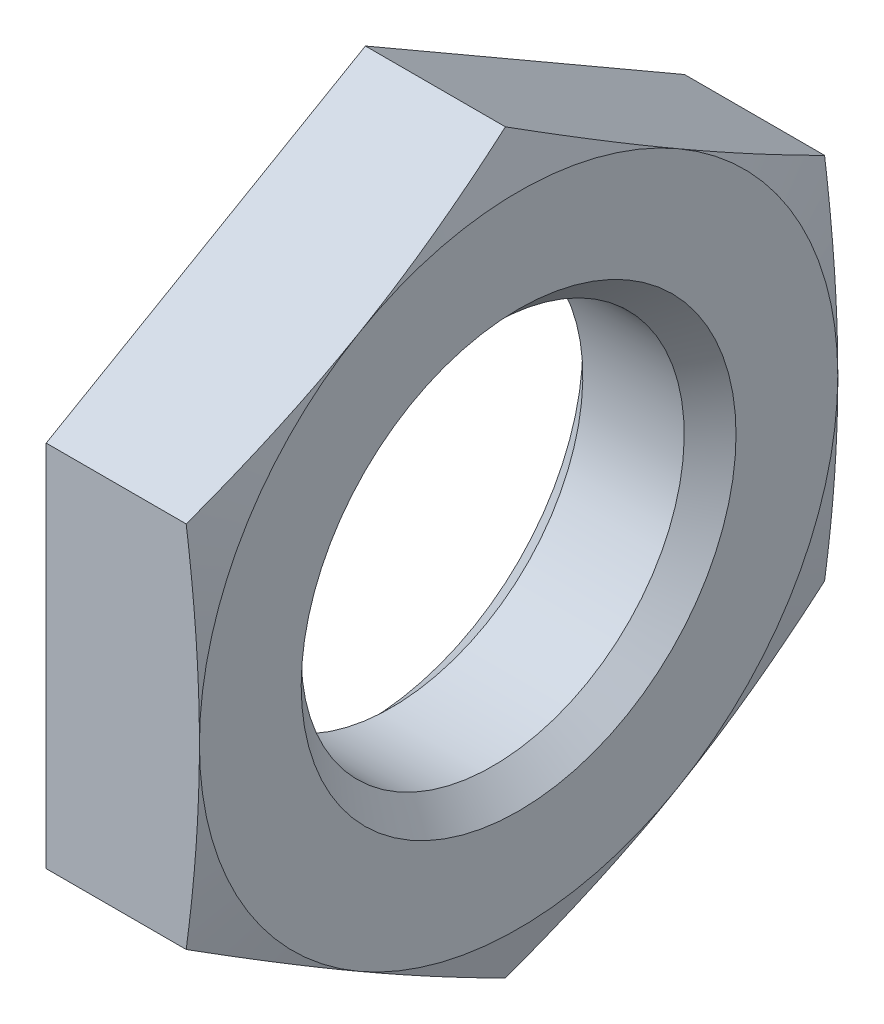
ISO-10303-21;
HEADER;
FILE_DESCRIPTION(('STEP AP214'),'2;1');
FILE_NAME('part.step','',(''),(''),'','','');
FILE_SCHEMA(('AUTOMOTIVE_DESIGN { 1 0 10303 214 1 1 1 1 }'));
ENDSEC;
DATA;
#1=APPLICATION_CONTEXT('core data for automotive mechanical design processes');
#2=APPLICATION_PROTOCOL_DEFINITION('international standard','automotive_design',2000,#1);
#3=PRODUCT_CONTEXT('',#1,'mechanical');
#4=PRODUCT('Part','Part','',(#3));
#5=PRODUCT_RELATED_PRODUCT_CATEGORY('part','',(#4));
#6=PRODUCT_DEFINITION_FORMATION('','',#4);
#7=PRODUCT_DEFINITION_CONTEXT('part definition',#1,'design');
#8=PRODUCT_DEFINITION('design','',#6,#7);
#9=PRODUCT_DEFINITION_SHAPE('','',#8);
#10=(LENGTH_UNIT() NAMED_UNIT(*) SI_UNIT(.MILLI.,.METRE.));
#11=(NAMED_UNIT(*) PLANE_ANGLE_UNIT() SI_UNIT($,.RADIAN.));
#12=(NAMED_UNIT(*) SI_UNIT($,.STERADIAN.) SOLID_ANGLE_UNIT());
#13=UNCERTAINTY_MEASURE_WITH_UNIT(LENGTH_MEASURE(1.E-05),#10,'distance_accuracy_value','');
#14=(GEOMETRIC_REPRESENTATION_CONTEXT(3) GLOBAL_UNCERTAINTY_ASSIGNED_CONTEXT((#13)) GLOBAL_UNIT_ASSIGNED_CONTEXT((#10,
#11,#12)) REPRESENTATION_CONTEXT('',''));
#15=CARTESIAN_POINT('',(0.,0.,0.));
#16=DIRECTION('',(0.,0.,1.));
#17=DIRECTION('',(1.,0.,0.));
#18=AXIS2_PLACEMENT_3D('',#15,#16,#17);
#19=CARTESIAN_POINT('',(-0.24,-4.3301270189222,-2.5));
#20=DIRECTION('',(0.,-0.866025403784439,-0.5));
#21=DIRECTION('',(0.,0.5,-0.866025403784439));
#22=AXIS2_PLACEMENT_3D('',#19,#20,#21);
#23=PLANE('',#22);
#24=DIRECTION('',(0.,-0.5,0.866025403784439));
#25=VECTOR('',#24,1.);
#26=CARTESIAN_POINT('',(0.,-3.95423059027645,-3.1510717127981));
#27=LINE('',#26,#25);
#28=CARTESIAN_POINT('',(0.,-2.88675134594813,-5.));
#29=VERTEX_POINT('',#28);
#30=CARTESIAN_POINT('',(0.,-5.77350269189626,0.));
#31=VERTEX_POINT('',#30);
#32=EDGE_CURVE('E122',#29,#31,#27,.T.);
#33=ORIENTED_EDGE('',*,*,#32,.F.);
#34=DIRECTION('',(1.,0.,0.));
#35=VECTOR('',#34,1.);
#36=CARTESIAN_POINT('',(-0.24,-2.88675134594813,-5.));
#37=LINE('',#36,#35);
#38=CARTESIAN_POINT('',(2.1927405783631,-2.88675134594813,-5.));
#39=VERTEX_POINT('',#38);
#40=EDGE_CURVE('E10',#29,#39,#37,.T.);
#41=ORIENTED_EDGE('',*,*,#40,.T.);
#42=CARTESIAN_POINT('',(2.12820765026172,-6.00137804865762,0.394691695703557));
#43=CARTESIAN_POINT('',(2.4,-5.08879735052134,-1.18594443947517));
#44=CARTESIAN_POINT('',(2.4,-4.3301270189222,-2.5));
#45=CARTESIAN_POINT('',(2.4,-3.57145668732306,-3.81405556052483));
#46=CARTESIAN_POINT('',(2.12820765026172,-2.65887598918677,-5.39469169570356));
#47=(BOUNDED_CURVE() B_SPLINE_CURVE(2,(#42,#43,#44,#45,#46),.UNSPECIFIED.,.F.,
.F.) B_SPLINE_CURVE_WITH_KNOTS((3,2,3),(0.,3.35590423776051,6.71180847552102),
.UNSPECIFIED.) CURVE() GEOMETRIC_REPRESENTATION_ITEM() RATIONAL_B_SPLINE_CURVE((1.,
1.04949239436652,1.,1.04949239436651,1.)) REPRESENTATION_ITEM(''));
#48=CARTESIAN_POINT('',(2.4,-4.3301270189222,-2.5));
#49=VERTEX_POINT('',#48);
#50=EDGE_CURVE('E149',#49,#39,#47,.T.);
#51=ORIENTED_EDGE('',*,*,#50,.F.);
#52=CARTESIAN_POINT('',(2.12820765026172,-6.00137804865762,0.394691695703557));
#53=CARTESIAN_POINT('',(2.4,-5.08879735052134,-1.18594443947517));
#54=CARTESIAN_POINT('',(2.4,-4.3301270189222,-2.5));
#55=CARTESIAN_POINT('',(2.4,-3.57145668732306,-3.81405556052483));
#56=CARTESIAN_POINT('',(2.12820765026172,-2.65887598918677,-5.39469169570356));
#57=(BOUNDED_CURVE() B_SPLINE_CURVE(2,(#52,#53,#54,#55,#56),.UNSPECIFIED.,.F.,
.F.) B_SPLINE_CURVE_WITH_KNOTS((3,2,3),(0.,3.35590423776051,6.71180847552102),
.UNSPECIFIED.) CURVE() GEOMETRIC_REPRESENTATION_ITEM() RATIONAL_B_SPLINE_CURVE((1.,
1.04949239436652,1.,1.04949239436651,1.)) REPRESENTATION_ITEM(''));
#58=CARTESIAN_POINT('',(2.1927405783631,-5.77350269189626,0.));
#59=VERTEX_POINT('',#58);
#60=EDGE_CURVE('E150',#59,#49,#57,.T.);
#61=ORIENTED_EDGE('',*,*,#60,.F.);
#62=DIRECTION('',(1.,0.,0.));
#63=VECTOR('',#62,1.);
#64=CARTESIAN_POINT('',(-0.24,-5.77350269189626,0.));
#65=LINE('',#64,#63);
#66=EDGE_CURVE('E133',#31,#59,#65,.T.);
#67=ORIENTED_EDGE('',*,*,#66,.F.);
#68=EDGE_LOOP('',(#33,#41,#51,#61,#67));
#69=FACE_BOUND('',#68,.T.);
#70=ADVANCED_FACE('F15',(#69),#23,.T.);
#71=CARTESIAN_POINT('',(-0.24,0.,-5.));
#72=DIRECTION('',(0.,0.,-1.));
#73=DIRECTION('',(0.,1.,0.));
#74=AXIS2_PLACEMENT_3D('',#71,#72,#73);
#75=PLANE('',#74);
#76=DIRECTION('',(0.,-1.,0.));
#77=VECTOR('',#76,1.);
#78=CARTESIAN_POINT('',(0.,1.50358571458295,-5.));
#79=LINE('',#78,#77);
#80=CARTESIAN_POINT('',(0.,2.88675134594812,-5.));
#81=VERTEX_POINT('',#80);
#82=EDGE_CURVE('E19',#81,#29,#79,.T.);
#83=ORIENTED_EDGE('',*,*,#82,.F.);
#84=DIRECTION('',(1.,0.,0.));
#85=VECTOR('',#84,1.);
#86=CARTESIAN_POINT('',(-0.24,2.88675134594812,-5.));
#87=LINE('',#86,#85);
#88=CARTESIAN_POINT('',(2.1927405783631,2.88675134594812,-5.));
#89=VERTEX_POINT('',#88);
#90=EDGE_CURVE('E24',#81,#89,#87,.T.);
#91=ORIENTED_EDGE('',*,*,#90,.T.);
#92=CARTESIAN_POINT('',(2.12820765026172,-3.34250205947085,-5.));
#93=CARTESIAN_POINT('',(2.4,-1.51734066319828,-5.));
#94=CARTESIAN_POINT('',(2.4,0.,-5.));
#95=CARTESIAN_POINT('',(2.4,1.51734066319828,-5.));
#96=CARTESIAN_POINT('',(2.12820765026172,3.34250205947085,-5.));
#97=(BOUNDED_CURVE() B_SPLINE_CURVE(2,(#92,#93,#94,#95,#96),.UNSPECIFIED.,.F.,
.F.) B_SPLINE_CURVE_WITH_KNOTS((3,2,3),(0.,3.35590423776051,6.71180847552102),
.UNSPECIFIED.) CURVE() GEOMETRIC_REPRESENTATION_ITEM() RATIONAL_B_SPLINE_CURVE((1.,
1.04949239436653,1.,1.04949239436653,1.)) REPRESENTATION_ITEM(''));
#98=CARTESIAN_POINT('',(2.4,0.,-5.));
#99=VERTEX_POINT('',#98);
#100=EDGE_CURVE('E175',#99,#89,#97,.T.);
#101=ORIENTED_EDGE('',*,*,#100,.F.);
#102=CARTESIAN_POINT('',(2.12820765026172,-3.34250205947085,-5.));
#103=CARTESIAN_POINT('',(2.4,-1.51734066319828,-5.));
#104=CARTESIAN_POINT('',(2.4,0.,-5.));
#105=CARTESIAN_POINT('',(2.4,1.51734066319828,-5.));
#106=CARTESIAN_POINT('',(2.12820765026172,3.34250205947085,-5.));
#107=(BOUNDED_CURVE() B_SPLINE_CURVE(2,(#102,#103,#104,#105,#106),.UNSPECIFIED.,.F.,
.F.) B_SPLINE_CURVE_WITH_KNOTS((3,2,3),(0.,3.35590423776051,6.71180847552102),
.UNSPECIFIED.) CURVE() GEOMETRIC_REPRESENTATION_ITEM() RATIONAL_B_SPLINE_CURVE((1.,
1.04949239436653,1.,1.04949239436653,1.)) REPRESENTATION_ITEM(''));
#108=EDGE_CURVE('E116',#39,#99,#107,.T.);
#109=ORIENTED_EDGE('',*,*,#108,.F.);
#110=ORIENTED_EDGE('',*,*,#40,.F.);
#111=EDGE_LOOP('',(#83,#91,#101,#109,#110));
#112=FACE_BOUND('',#111,.T.);
#113=ADVANCED_FACE('F278',(#112),#75,.T.);
#114=CARTESIAN_POINT('',(-0.24,4.3301270189222,-2.5));
#115=DIRECTION('',(0.,0.866025403784439,-0.5));
#116=DIRECTION('',(0.,0.5,0.866025403784439));
#117=AXIS2_PLACEMENT_3D('',#114,#115,#116);
#118=PLANE('',#117);
#119=DIRECTION('',(0.,-0.5,-0.866025403784439));
#120=VECTOR('',#119,1.);
#121=CARTESIAN_POINT('',(0.,4.70602344756793,-1.8489282872019));
#122=LINE('',#121,#120);
#123=CARTESIAN_POINT('',(0.,5.77350269189626,0.));
#124=VERTEX_POINT('',#123);
#125=EDGE_CURVE('E173',#124,#81,#122,.T.);
#126=ORIENTED_EDGE('',*,*,#125,.F.);
#127=DIRECTION('',(1.,0.,0.));
#128=VECTOR('',#127,1.);
#129=CARTESIAN_POINT('',(-0.24,5.77350269189626,0.));
#130=LINE('',#129,#128);
#131=CARTESIAN_POINT('',(2.1927405783631,5.77350269189626,0.));
#132=VERTEX_POINT('',#131);
#133=EDGE_CURVE('E117',#124,#132,#130,.T.);
#134=ORIENTED_EDGE('',*,*,#133,.T.);
#135=CARTESIAN_POINT('',(2.12820765026172,2.65887598918677,-5.39469169570356));
#136=CARTESIAN_POINT('',(2.4,3.57145668732307,-3.81405556052483));
#137=CARTESIAN_POINT('',(2.4,4.33012701892219,-2.5));
#138=CARTESIAN_POINT('',(2.4,5.08879735052132,-1.18594443947518));
#139=CARTESIAN_POINT('',(2.12820765026172,6.00137804865762,0.394691695703558));
#140=(BOUNDED_CURVE() B_SPLINE_CURVE(2,(#135,#136,#137,#138,#139),.UNSPECIFIED.,.F.,
.F.) B_SPLINE_CURVE_WITH_KNOTS((3,2,3),(0.,3.35590423776051,6.71180847552102),
.UNSPECIFIED.) CURVE() GEOMETRIC_REPRESENTATION_ITEM() RATIONAL_B_SPLINE_CURVE((1.,
1.04949239436653,1.,1.04949239436651,1.)) REPRESENTATION_ITEM(''));
#141=CARTESIAN_POINT('',(2.4,4.33012701892219,-2.5));
#142=VERTEX_POINT('',#141);
#143=EDGE_CURVE('E98',#142,#132,#140,.T.);
#144=ORIENTED_EDGE('',*,*,#143,.F.);
#145=CARTESIAN_POINT('',(2.12820765026172,2.65887598918677,-5.39469169570356));
#146=CARTESIAN_POINT('',(2.4,3.57145668732307,-3.81405556052483));
#147=CARTESIAN_POINT('',(2.4,4.33012701892219,-2.5));
#148=CARTESIAN_POINT('',(2.4,5.08879735052132,-1.18594443947518));
#149=CARTESIAN_POINT('',(2.12820765026172,6.00137804865762,0.394691695703558));
#150=(BOUNDED_CURVE() B_SPLINE_CURVE(2,(#145,#146,#147,#148,#149),.UNSPECIFIED.,.F.,
.F.) B_SPLINE_CURVE_WITH_KNOTS((3,2,3),(0.,3.35590423776051,6.71180847552102),
.UNSPECIFIED.) CURVE() GEOMETRIC_REPRESENTATION_ITEM() RATIONAL_B_SPLINE_CURVE((1.,
1.04949239436653,1.,1.04949239436651,1.)) REPRESENTATION_ITEM(''));
#151=EDGE_CURVE('E86',#89,#142,#150,.T.);
#152=ORIENTED_EDGE('',*,*,#151,.F.);
#153=ORIENTED_EDGE('',*,*,#90,.F.);
#154=EDGE_LOOP('',(#126,#134,#144,#152,#153));
#155=FACE_BOUND('',#154,.T.);
#156=ADVANCED_FACE('F243',(#155),#118,.T.);
#157=CARTESIAN_POINT('',(-0.24,-4.3301270189222,2.5));
#158=DIRECTION('',(0.,-0.866025403784439,0.5));
#159=DIRECTION('',(0.,-0.5,-0.866025403784439));
#160=AXIS2_PLACEMENT_3D('',#157,#158,#159);
#161=PLANE('',#160);
#162=DIRECTION('',(0.,0.5,0.866025403784439));
#163=VECTOR('',#162,1.);
#164=CARTESIAN_POINT('',(0.,-3.95423059027645,3.15107171279811));
#165=LINE('',#164,#163);
#166=CARTESIAN_POINT('',(0.,-2.88675134594813,5.));
#167=VERTEX_POINT('',#166);
#168=EDGE_CURVE('E115',#31,#167,#165,.T.);
#169=ORIENTED_EDGE('',*,*,#168,.F.);
#170=ORIENTED_EDGE('',*,*,#66,.T.);
#171=CARTESIAN_POINT('',(2.12820765026172,-2.65887598918677,5.39469169570356));
#172=CARTESIAN_POINT('',(2.4,-3.57145668732306,3.81405556052482));
#173=CARTESIAN_POINT('',(2.4,-4.3301270189222,2.5));
#174=CARTESIAN_POINT('',(2.4,-5.08879735052134,1.18594443947517));
#175=CARTESIAN_POINT('',(2.12820765026172,-6.00137804865762,-0.394691695703558));
#176=(BOUNDED_CURVE() B_SPLINE_CURVE(2,(#171,#172,#173,#174,#175),.UNSPECIFIED.,.F.,
.F.) B_SPLINE_CURVE_WITH_KNOTS((3,2,3),(0.,3.35590423776052,6.71180847552102),
.UNSPECIFIED.) CURVE() GEOMETRIC_REPRESENTATION_ITEM() RATIONAL_B_SPLINE_CURVE((1.,
1.04949239436654,1.,1.0494923943665,1.)) REPRESENTATION_ITEM(''));
#177=CARTESIAN_POINT('',(2.4,-4.3301270189222,2.5));
#178=VERTEX_POINT('',#177);
#179=EDGE_CURVE('E111',#178,#59,#176,.T.);
#180=ORIENTED_EDGE('',*,*,#179,.F.);
#181=CARTESIAN_POINT('',(2.12820765026172,-2.65887598918677,5.39469169570356));
#182=CARTESIAN_POINT('',(2.4,-3.57145668732306,3.81405556052482));
#183=CARTESIAN_POINT('',(2.4,-4.3301270189222,2.5));
#184=CARTESIAN_POINT('',(2.4,-5.08879735052134,1.18594443947517));
#185=CARTESIAN_POINT('',(2.12820765026172,-6.00137804865762,-0.394691695703558));
#186=(BOUNDED_CURVE() B_SPLINE_CURVE(2,(#181,#182,#183,#184,#185),.UNSPECIFIED.,.F.,
.F.) B_SPLINE_CURVE_WITH_KNOTS((3,2,3),(0.,3.35590423776052,6.71180847552102),
.UNSPECIFIED.) CURVE() GEOMETRIC_REPRESENTATION_ITEM() RATIONAL_B_SPLINE_CURVE((1.,
1.04949239436654,1.,1.0494923943665,1.)) REPRESENTATION_ITEM(''));
#187=CARTESIAN_POINT('',(2.1927405783631,-2.88675134594813,5.));
#188=VERTEX_POINT('',#187);
#189=EDGE_CURVE('E112',#188,#178,#186,.T.);
#190=ORIENTED_EDGE('',*,*,#189,.F.);
#191=DIRECTION('',(1.,0.,0.));
#192=VECTOR('',#191,1.);
#193=CARTESIAN_POINT('',(-0.24,-2.88675134594813,5.));
#194=LINE('',#193,#192);
#195=EDGE_CURVE('E120',#167,#188,#194,.T.);
#196=ORIENTED_EDGE('',*,*,#195,.F.);
#197=EDGE_LOOP('',(#169,#170,#180,#190,#196));
#198=FACE_BOUND('',#197,.T.);
#199=ADVANCED_FACE('F270',(#198),#161,.T.);
#200=CARTESIAN_POINT('',(-0.24,0.,5.));
#201=DIRECTION('',(0.,0.,1.));
#202=DIRECTION('',(0.,-1.,0.));
#203=AXIS2_PLACEMENT_3D('',#200,#201,#202);
#204=PLANE('',#203);
#205=DIRECTION('',(0.,1.,0.));
#206=VECTOR('',#205,1.);
#207=CARTESIAN_POINT('',(0.,1.50358571458295,5.));
#208=LINE('',#207,#206);
#209=CARTESIAN_POINT('',(0.,2.88675134594813,5.));
#210=VERTEX_POINT('',#209);
#211=EDGE_CURVE('E174',#167,#210,#208,.T.);
#212=ORIENTED_EDGE('',*,*,#211,.F.);
#213=ORIENTED_EDGE('',*,*,#195,.T.);
#214=CARTESIAN_POINT('',(2.12820765026172,3.34250205947085,5.));
#215=CARTESIAN_POINT('',(2.4,1.51734066319828,4.99999999999999));
#216=CARTESIAN_POINT('',(2.4,0.,5.));
#217=CARTESIAN_POINT('',(2.4,-1.51734066319828,5.));
#218=CARTESIAN_POINT('',(2.12820765026172,-3.34250205947085,5.));
#219=(BOUNDED_CURVE() B_SPLINE_CURVE(2,(#214,#215,#216,#217,#218),.UNSPECIFIED.,.F.,
.F.) B_SPLINE_CURVE_WITH_KNOTS((3,2,3),(0.,3.35590423776052,6.71180847552103),
.UNSPECIFIED.) CURVE() GEOMETRIC_REPRESENTATION_ITEM() RATIONAL_B_SPLINE_CURVE((1.,
1.04949239436656,1.,1.04949239436653,1.)) REPRESENTATION_ITEM(''));
#220=CARTESIAN_POINT('',(2.4,0.,5.));
#221=VERTEX_POINT('',#220);
#222=EDGE_CURVE('E140',#221,#188,#219,.T.);
#223=ORIENTED_EDGE('',*,*,#222,.F.);
#224=CARTESIAN_POINT('',(2.12820765026172,3.34250205947085,5.));
#225=CARTESIAN_POINT('',(2.4,1.51734066319828,4.99999999999999));
#226=CARTESIAN_POINT('',(2.4,0.,5.));
#227=CARTESIAN_POINT('',(2.4,-1.51734066319828,5.));
#228=CARTESIAN_POINT('',(2.12820765026172,-3.34250205947085,5.));
#229=(BOUNDED_CURVE() B_SPLINE_CURVE(2,(#224,#225,#226,#227,#228),.UNSPECIFIED.,.F.,
.F.) B_SPLINE_CURVE_WITH_KNOTS((3,2,3),(0.,3.35590423776052,6.71180847552103),
.UNSPECIFIED.) CURVE() GEOMETRIC_REPRESENTATION_ITEM() RATIONAL_B_SPLINE_CURVE((1.,
1.04949239436656,1.,1.04949239436653,1.)) REPRESENTATION_ITEM(''));
#230=CARTESIAN_POINT('',(2.1927405783631,2.88675134594813,5.));
#231=VERTEX_POINT('',#230);
#232=EDGE_CURVE('E103',#231,#221,#229,.T.);
#233=ORIENTED_EDGE('',*,*,#232,.F.);
#234=DIRECTION('',(1.,0.,0.));
#235=VECTOR('',#234,1.);
#236=CARTESIAN_POINT('',(-0.24,2.88675134594813,5.));
#237=LINE('',#236,#235);
#238=EDGE_CURVE('E121',#210,#231,#237,.T.);
#239=ORIENTED_EDGE('',*,*,#238,.F.);
#240=EDGE_LOOP('',(#212,#213,#223,#233,#239));
#241=FACE_BOUND('',#240,.T.);
#242=ADVANCED_FACE('F264',(#241),#204,.T.);
#243=CARTESIAN_POINT('',(-0.24,4.3301270189222,2.5));
#244=DIRECTION('',(0.,0.866025403784439,0.5));
#245=DIRECTION('',(0.,-0.5,0.866025403784439));
#246=AXIS2_PLACEMENT_3D('',#243,#244,#245);
#247=PLANE('',#246);
#248=DIRECTION('',(0.,0.5,-0.866025403784439));
#249=VECTOR('',#248,1.);
#250=CARTESIAN_POINT('',(0.,4.70602344756793,1.84892828720189));
#251=LINE('',#250,#249);
#252=EDGE_CURVE('E167',#210,#124,#251,.T.);
#253=ORIENTED_EDGE('',*,*,#252,.F.);
#254=ORIENTED_EDGE('',*,*,#238,.T.);
#255=CARTESIAN_POINT('',(2.12820765026172,6.00137804865762,-0.39469169570356));
#256=CARTESIAN_POINT('',(2.4,5.08879735052134,1.18594443947518));
#257=CARTESIAN_POINT('',(2.4,4.3301270189222,2.5));
#258=CARTESIAN_POINT('',(2.4,3.57145668732306,3.81405556052482));
#259=CARTESIAN_POINT('',(2.12820765026172,2.65887598918678,5.39469169570356));
#260=(BOUNDED_CURVE() B_SPLINE_CURVE(2,(#255,#256,#257,#258,#259),.UNSPECIFIED.,.F.,
.F.) B_SPLINE_CURVE_WITH_KNOTS((3,2,3),(0.,3.35590423776051,6.71180847552102),
.UNSPECIFIED.) CURVE() GEOMETRIC_REPRESENTATION_ITEM() RATIONAL_B_SPLINE_CURVE((1.,
1.04949239436652,1.,1.04949239436654,1.)) REPRESENTATION_ITEM(''));
#261=CARTESIAN_POINT('',(2.4,4.3301270189222,2.5));
#262=VERTEX_POINT('',#261);
#263=EDGE_CURVE('E162',#262,#231,#260,.T.);
#264=ORIENTED_EDGE('',*,*,#263,.F.);
#265=CARTESIAN_POINT('',(2.12820765026172,6.00137804865762,-0.39469169570356));
#266=CARTESIAN_POINT('',(2.4,5.08879735052134,1.18594443947518));
#267=CARTESIAN_POINT('',(2.4,4.3301270189222,2.5));
#268=CARTESIAN_POINT('',(2.4,3.57145668732306,3.81405556052482));
#269=CARTESIAN_POINT('',(2.12820765026172,2.65887598918678,5.39469169570356));
#270=(BOUNDED_CURVE() B_SPLINE_CURVE(2,(#265,#266,#267,#268,#269),.UNSPECIFIED.,.F.,
.F.) B_SPLINE_CURVE_WITH_KNOTS((3,2,3),(0.,3.35590423776051,6.71180847552102),
.UNSPECIFIED.) CURVE() GEOMETRIC_REPRESENTATION_ITEM() RATIONAL_B_SPLINE_CURVE((1.,
1.04949239436652,1.,1.04949239436654,1.)) REPRESENTATION_ITEM(''));
#271=EDGE_CURVE('E180',#132,#262,#270,.T.);
#272=ORIENTED_EDGE('',*,*,#271,.F.);
#273=ORIENTED_EDGE('',*,*,#133,.F.);
#274=EDGE_LOOP('',(#253,#254,#264,#272,#273));
#275=FACE_BOUND('',#274,.T.);
#276=ADVANCED_FACE('F252',(#275),#247,.T.);
#277=CARTESIAN_POINT('',(2.4,2.5,0.));
#278=DIRECTION('',(1.,0.,0.));
#279=DIRECTION('',(0.,1.,0.));
#280=AXIS2_PLACEMENT_3D('',#277,#278,#279);
#281=PLANE('',#280);
#282=CARTESIAN_POINT('',(2.4,0.,0.));
#283=DIRECTION('',(1.,0.,0.));
#284=DIRECTION('',(0.,1.,0.));
#285=AXIS2_PLACEMENT_3D('',#282,#283,#284);
#286=CIRCLE('',#285,5.);
#287=EDGE_CURVE('E104',#142,#262,#286,.T.);
#288=ORIENTED_EDGE('',*,*,#287,.T.);
#289=CARTESIAN_POINT('',(2.4,0.,0.));
#290=DIRECTION('',(1.,0.,0.));
#291=DIRECTION('',(0.,1.,0.));
#292=AXIS2_PLACEMENT_3D('',#289,#290,#291);
#293=CIRCLE('',#292,5.);
#294=EDGE_CURVE('E96',#262,#221,#293,.T.);
#295=ORIENTED_EDGE('',*,*,#294,.T.);
#296=CARTESIAN_POINT('',(2.4,0.,0.));
#297=DIRECTION('',(1.,0.,0.));
#298=DIRECTION('',(0.,1.,0.));
#299=AXIS2_PLACEMENT_3D('',#296,#297,#298);
#300=CIRCLE('',#299,5.);
#301=EDGE_CURVE('E105',#221,#178,#300,.T.);
#302=ORIENTED_EDGE('',*,*,#301,.T.);
#303=CARTESIAN_POINT('',(2.4,0.,0.));
#304=DIRECTION('',(1.,0.,0.));
#305=DIRECTION('',(0.,1.,0.));
#306=AXIS2_PLACEMENT_3D('',#303,#304,#305);
#307=CIRCLE('',#306,5.);
#308=EDGE_CURVE('E146',#178,#49,#307,.T.);
#309=ORIENTED_EDGE('',*,*,#308,.T.);
#310=CARTESIAN_POINT('',(2.4,0.,0.));
#311=DIRECTION('',(1.,0.,0.));
#312=DIRECTION('',(0.,1.,0.));
#313=AXIS2_PLACEMENT_3D('',#310,#311,#312);
#314=CIRCLE('',#313,5.);
#315=EDGE_CURVE('E113',#49,#99,#314,.T.);
#316=ORIENTED_EDGE('',*,*,#315,.T.);
#317=CARTESIAN_POINT('',(2.4,0.,0.));
#318=DIRECTION('',(1.,0.,0.));
#319=DIRECTION('',(0.,1.,0.));
#320=AXIS2_PLACEMENT_3D('',#317,#318,#319);
#321=CIRCLE('',#320,5.);
#322=EDGE_CURVE('E90',#99,#142,#321,.T.);
#323=ORIENTED_EDGE('',*,*,#322,.T.);
#324=EDGE_LOOP('',(#288,#295,#302,#309,#316,#323));
#325=FACE_BOUND('',#324,.T.);
#326=CARTESIAN_POINT('',(2.4,0.,0.));
#327=DIRECTION('',(-1.,0.,0.));
#328=DIRECTION('',(0.,1.,0.));
#329=AXIS2_PLACEMENT_3D('',#326,#327,#328);
#330=CIRCLE('',#329,3.4059375);
#331=CARTESIAN_POINT('',(2.4,3.4059375,0.));
#332=VERTEX_POINT('',#331);
#333=EDGE_CURVE('E83',#332,#332,#330,.T.);
#334=ORIENTED_EDGE('',*,*,#333,.T.);
#335=EDGE_LOOP('',(#334));
#336=FACE_BOUND('',#335,.T.);
#337=ADVANCED_FACE('F84',(#325,#336),#281,.T.);
#338=CARTESIAN_POINT('',(0.,3.00717142916591,0.));
#339=DIRECTION('',(-1.,0.,0.));
#340=DIRECTION('',(0.,-1.,0.));
#341=AXIS2_PLACEMENT_3D('',#338,#339,#340);
#342=PLANE('',#341);
#343=ORIENTED_EDGE('',*,*,#168,.T.);
#344=ORIENTED_EDGE('',*,*,#211,.T.);
#345=ORIENTED_EDGE('',*,*,#252,.T.);
#346=ORIENTED_EDGE('',*,*,#125,.T.);
#347=ORIENTED_EDGE('',*,*,#82,.T.);
#348=ORIENTED_EDGE('',*,*,#32,.T.);
#349=EDGE_LOOP('',(#343,#344,#345,#346,#347,#348));
#350=FACE_BOUND('',#349,.T.);
#351=CARTESIAN_POINT('',(0.,0.,0.));
#352=DIRECTION('',(1.,0.,0.));
#353=DIRECTION('',(0.,1.,0.));
#354=AXIS2_PLACEMENT_3D('',#351,#352,#353);
#355=CIRCLE('',#354,3.4059375);
#356=CARTESIAN_POINT('',(0.,3.4059375,0.));
#357=VERTEX_POINT('',#356);
#358=EDGE_CURVE('E92',#357,#357,#355,.T.);
#359=ORIENTED_EDGE('',*,*,#358,.T.);
#360=EDGE_LOOP('',(#359));
#361=FACE_BOUND('',#360,.T.);
#362=ADVANCED_FACE('F280',(#350,#361),#342,.T.);
#363=CARTESIAN_POINT('',(2.26410382513086,0.,0.));
#364=DIRECTION('',(-1.,0.,0.));
#365=DIRECTION('',(0.,1.,0.));
#366=AXIS2_PLACEMENT_3D('',#363,#364,#365);
#367=CONICAL_SURFACE('',#366,5.5071714291659,1.30899693899575);
#368=ORIENTED_EDGE('',*,*,#50,.T.);
#369=ORIENTED_EDGE('',*,*,#108,.T.);
#370=ORIENTED_EDGE('',*,*,#315,.F.);
#371=EDGE_LOOP('',(#368,#369,#370));
#372=FACE_BOUND('',#371,.T.);
#373=ADVANCED_FACE('F277',(#372),#367,.T.);
#374=CARTESIAN_POINT('',(2.26410382513086,0.,0.));
#375=DIRECTION('',(-1.,0.,0.));
#376=DIRECTION('',(0.,1.,0.));
#377=AXIS2_PLACEMENT_3D('',#374,#375,#376);
#378=CONICAL_SURFACE('',#377,5.5071714291659,1.30899693899575);
#379=ORIENTED_EDGE('',*,*,#179,.T.);
#380=ORIENTED_EDGE('',*,*,#60,.T.);
#381=ORIENTED_EDGE('',*,*,#308,.F.);
#382=EDGE_LOOP('',(#379,#380,#381));
#383=FACE_BOUND('',#382,.T.);
#384=ADVANCED_FACE('F273',(#383),#378,.T.);
#385=CARTESIAN_POINT('',(2.26410382513086,0.,0.));
#386=DIRECTION('',(-1.,0.,0.));
#387=DIRECTION('',(0.,1.,0.));
#388=AXIS2_PLACEMENT_3D('',#385,#386,#387);
#389=CONICAL_SURFACE('',#388,5.5071714291659,1.30899693899575);
#390=ORIENTED_EDGE('',*,*,#222,.T.);
#391=ORIENTED_EDGE('',*,*,#189,.T.);
#392=ORIENTED_EDGE('',*,*,#301,.F.);
#393=EDGE_LOOP('',(#390,#391,#392));
#394=FACE_BOUND('',#393,.T.);
#395=ADVANCED_FACE('F267',(#394),#389,.T.);
#396=CARTESIAN_POINT('',(2.26410382513086,0.,0.));
#397=DIRECTION('',(-1.,0.,0.));
#398=DIRECTION('',(0.,1.,0.));
#399=AXIS2_PLACEMENT_3D('',#396,#397,#398);
#400=CONICAL_SURFACE('',#399,5.5071714291659,1.30899693899575);
#401=ORIENTED_EDGE('',*,*,#232,.T.);
#402=ORIENTED_EDGE('',*,*,#294,.F.);
#403=ORIENTED_EDGE('',*,*,#263,.T.);
#404=EDGE_LOOP('',(#401,#402,#403));
#405=FACE_BOUND('',#404,.T.);
#406=ADVANCED_FACE('F17',(#405),#400,.T.);
#407=CARTESIAN_POINT('',(2.26410382513086,0.,0.));
#408=DIRECTION('',(-1.,0.,0.));
#409=DIRECTION('',(0.,1.,0.));
#410=AXIS2_PLACEMENT_3D('',#407,#408,#409);
#411=CONICAL_SURFACE('',#410,5.5071714291659,1.30899693899575);
#412=ORIENTED_EDGE('',*,*,#271,.T.);
#413=ORIENTED_EDGE('',*,*,#287,.F.);
#414=ORIENTED_EDGE('',*,*,#143,.T.);
#415=EDGE_LOOP('',(#412,#413,#414));
#416=FACE_BOUND('',#415,.T.);
#417=ADVANCED_FACE('F246',(#416),#411,.T.);
#418=CARTESIAN_POINT('',(2.26410382513086,0.,0.));
#419=DIRECTION('',(-1.,0.,0.));
#420=DIRECTION('',(0.,1.,0.));
#421=AXIS2_PLACEMENT_3D('',#418,#419,#420);
#422=CONICAL_SURFACE('',#421,5.5071714291659,1.30899693899575);
#423=ORIENTED_EDGE('',*,*,#151,.T.);
#424=ORIENTED_EDGE('',*,*,#322,.F.);
#425=ORIENTED_EDGE('',*,*,#100,.T.);
#426=EDGE_LOOP('',(#423,#424,#425));
#427=FACE_BOUND('',#426,.T.);
#428=ADVANCED_FACE('F241',(#427),#422,.T.);
#429=CARTESIAN_POINT('',(2.19703125,0.,0.));
#430=DIRECTION('',(1.,0.,0.));
#431=DIRECTION('',(0.,1.,0.));
#432=AXIS2_PLACEMENT_3D('',#429,#430,#431);
#433=CONICAL_SURFACE('',#432,3.20296875,0.785398163397448);
#434=CARTESIAN_POINT('',(1.9940625,0.,0.));
#435=DIRECTION('',(1.,0.,0.));
#436=DIRECTION('',(0.,1.,0.));
#437=AXIS2_PLACEMENT_3D('',#434,#435,#436);
#438=CIRCLE('',#437,3.);
#439=CARTESIAN_POINT('',(1.9940625,3.,0.));
#440=VERTEX_POINT('',#439);
#441=EDGE_CURVE('E87',#440,#440,#438,.T.);
#442=ORIENTED_EDGE('',*,*,#441,.F.);
#443=EDGE_LOOP('',(#442));
#444=FACE_BOUND('',#443,.T.);
#445=ORIENTED_EDGE('',*,*,#333,.F.);
#446=EDGE_LOOP('',(#445));
#447=FACE_BOUND('',#446,.T.);
#448=ADVANCED_FACE('F295',(#444,#447),#433,.F.);
#449=CARTESIAN_POINT('',(1.2,0.,0.));
#450=DIRECTION('',(-1.,0.,0.));
#451=DIRECTION('',(0.,1.,0.));
#452=AXIS2_PLACEMENT_3D('',#449,#450,#451);
#453=CYLINDRICAL_SURFACE('',#452,3.);
#454=CARTESIAN_POINT('',(0.4059375,0.,0.));
#455=DIRECTION('',(1.,0.,0.));
#456=DIRECTION('',(0.,1.,0.));
#457=AXIS2_PLACEMENT_3D('',#454,#455,#456);
#458=CIRCLE('',#457,3.);
#459=CARTESIAN_POINT('',(0.4059375,3.,0.));
#460=VERTEX_POINT('',#459);
#461=EDGE_CURVE('E145',#460,#460,#458,.T.);
#462=ORIENTED_EDGE('',*,*,#461,.F.);
#463=EDGE_LOOP('',(#462));
#464=FACE_BOUND('',#463,.T.);
#465=ORIENTED_EDGE('',*,*,#441,.T.);
#466=EDGE_LOOP('',(#465));
#467=FACE_BOUND('',#466,.T.);
#468=ADVANCED_FACE('F289',(#464,#467),#453,.F.);
#469=CARTESIAN_POINT('',(0.20296875,0.,0.));
#470=DIRECTION('',(-1.,0.,0.));
#471=DIRECTION('',(0.,1.,0.));
#472=AXIS2_PLACEMENT_3D('',#469,#470,#471);
#473=CONICAL_SURFACE('',#472,3.20296875,0.785398163397449);
#474=ORIENTED_EDGE('',*,*,#358,.F.);
#475=EDGE_LOOP('',(#474));
#476=FACE_BOUND('',#475,.T.);
#477=ORIENTED_EDGE('',*,*,#461,.T.);
#478=EDGE_LOOP('',(#477));
#479=FACE_BOUND('',#478,.T.);
#480=ADVANCED_FACE('F286',(#476,#479),#473,.F.);
#481=CLOSED_SHELL('',(#70,#113,#156,#199,#242,#276,#337,#362,#373,#384,#395,#406,#417,#428,#448,
#468,#480));
#482=MANIFOLD_SOLID_BREP('B1',#481);
#483=ADVANCED_BREP_SHAPE_REPRESENTATION('',(#18,#482),#14);
#484=SHAPE_DEFINITION_REPRESENTATION(#9,#483);
ENDSEC;
END-ISO-10303-21;
